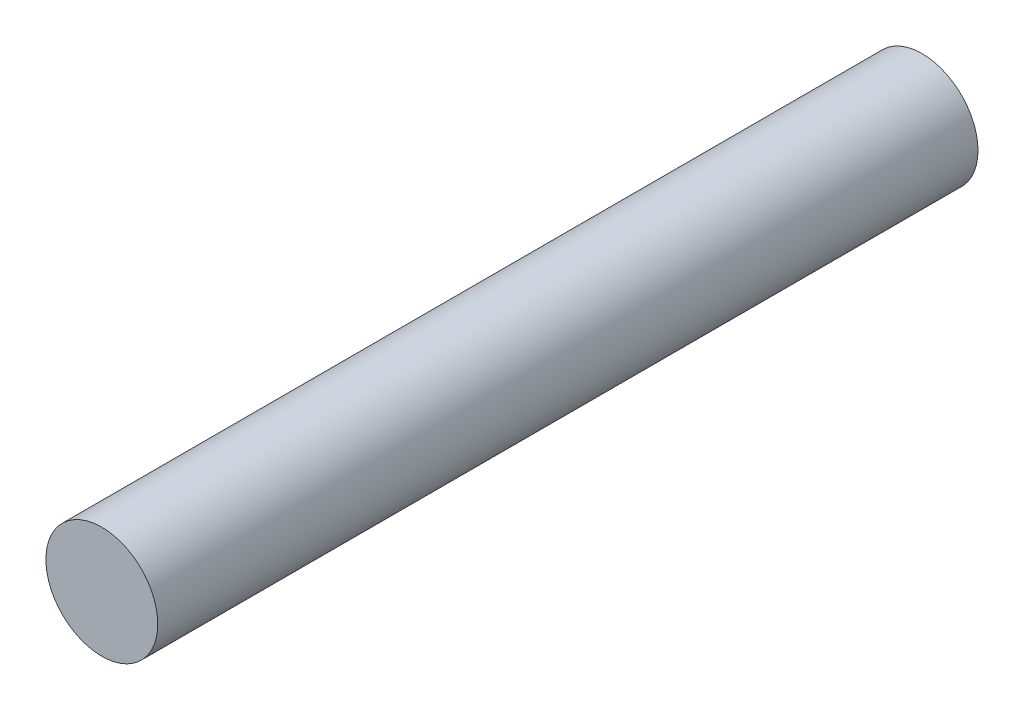
ISO-10303-21;
HEADER;
FILE_DESCRIPTION(('STEP AP214'),'2;1');
FILE_NAME('part.step','',(''),(''),'','','');
FILE_SCHEMA(('AUTOMOTIVE_DESIGN { 1 0 10303 214 1 1 1 1 }'));
ENDSEC;
DATA;
#1=APPLICATION_CONTEXT('core data for automotive mechanical design processes');
#2=APPLICATION_PROTOCOL_DEFINITION('international standard','automotive_design',2000,#1);
#3=PRODUCT_CONTEXT('',#1,'mechanical');
#4=PRODUCT('Part','Part','',(#3));
#5=PRODUCT_RELATED_PRODUCT_CATEGORY('part','',(#4));
#6=PRODUCT_DEFINITION_FORMATION('','',#4);
#7=PRODUCT_DEFINITION_CONTEXT('part definition',#1,'design');
#8=PRODUCT_DEFINITION('design','',#6,#7);
#9=PRODUCT_DEFINITION_SHAPE('','',#8);
#10=(LENGTH_UNIT() NAMED_UNIT(*) SI_UNIT(.MILLI.,.METRE.));
#11=(NAMED_UNIT(*) PLANE_ANGLE_UNIT() SI_UNIT($,.RADIAN.));
#12=(NAMED_UNIT(*) SI_UNIT($,.STERADIAN.) SOLID_ANGLE_UNIT());
#13=UNCERTAINTY_MEASURE_WITH_UNIT(LENGTH_MEASURE(1.E-05),#10,'distance_accuracy_value','');
#14=(GEOMETRIC_REPRESENTATION_CONTEXT(3) GLOBAL_UNCERTAINTY_ASSIGNED_CONTEXT((#13)) GLOBAL_UNIT_ASSIGNED_CONTEXT((#10,
#11,#12)) REPRESENTATION_CONTEXT('',''));
#15=CARTESIAN_POINT('',(0.,0.,0.));
#16=DIRECTION('',(0.,0.,1.));
#17=DIRECTION('',(1.,0.,0.));
#18=AXIS2_PLACEMENT_3D('',#15,#16,#17);
#19=CARTESIAN_POINT('',(0.,0.,220.));
#20=DIRECTION('',(0.,0.,-1.));
#21=DIRECTION('',(-1.,0.,0.));
#22=AXIS2_PLACEMENT_3D('',#19,#20,#21);
#23=CYLINDRICAL_SURFACE('',#22,15.);
#24=CARTESIAN_POINT('',(0.,0.,220.));
#25=DIRECTION('',(0.,0.,1.));
#26=DIRECTION('',(1.,0.,0.));
#27=AXIS2_PLACEMENT_3D('',#24,#25,#26);
#28=CIRCLE('',#27,15.);
#29=CARTESIAN_POINT('',(15.,0.,220.));
#30=VERTEX_POINT('',#29);
#31=EDGE_CURVE('E10',#30,#30,#28,.T.);
#32=ORIENTED_EDGE('',*,*,#31,.F.);
#33=EDGE_LOOP('',(#32));
#34=FACE_BOUND('',#33,.T.);
#35=CARTESIAN_POINT('',(0.,0.,0.));
#36=DIRECTION('',(0.,0.,1.));
#37=DIRECTION('',(1.,0.,0.));
#38=AXIS2_PLACEMENT_3D('',#35,#36,#37);
#39=CIRCLE('',#38,15.);
#40=CARTESIAN_POINT('',(15.,0.,0.));
#41=VERTEX_POINT('',#40);
#42=EDGE_CURVE('E34',#41,#41,#39,.T.);
#43=ORIENTED_EDGE('',*,*,#42,.T.);
#44=EDGE_LOOP('',(#43));
#45=FACE_BOUND('',#44,.T.);
#46=ADVANCED_FACE('F31',(#34,#45),#23,.T.);
#47=CARTESIAN_POINT('',(0.,0.,220.));
#48=DIRECTION('',(0.,0.,1.));
#49=DIRECTION('',(1.,0.,0.));
#50=AXIS2_PLACEMENT_3D('',#47,#48,#49);
#51=PLANE('',#50);
#52=ORIENTED_EDGE('',*,*,#31,.T.);
#53=EDGE_LOOP('',(#52));
#54=FACE_BOUND('',#53,.T.);
#55=ADVANCED_FACE('F46',(#54),#51,.T.);
#56=CARTESIAN_POINT('',(0.,0.,0.));
#57=DIRECTION('',(0.,0.,1.));
#58=DIRECTION('',(1.,0.,0.));
#59=AXIS2_PLACEMENT_3D('',#56,#57,#58);
#60=PLANE('',#59);
#61=ORIENTED_EDGE('',*,*,#42,.F.);
#62=EDGE_LOOP('',(#61));
#63=FACE_BOUND('',#62,.T.);
#64=ADVANCED_FACE('F44',(#63),#60,.F.);
#65=CLOSED_SHELL('',(#46,#55,#64));
#66=MANIFOLD_SOLID_BREP('B2',#65);
#67=ADVANCED_BREP_SHAPE_REPRESENTATION('',(#18,#66),#14);
#68=SHAPE_DEFINITION_REPRESENTATION(#9,#67);
ENDSEC;
END-ISO-10303-21;
